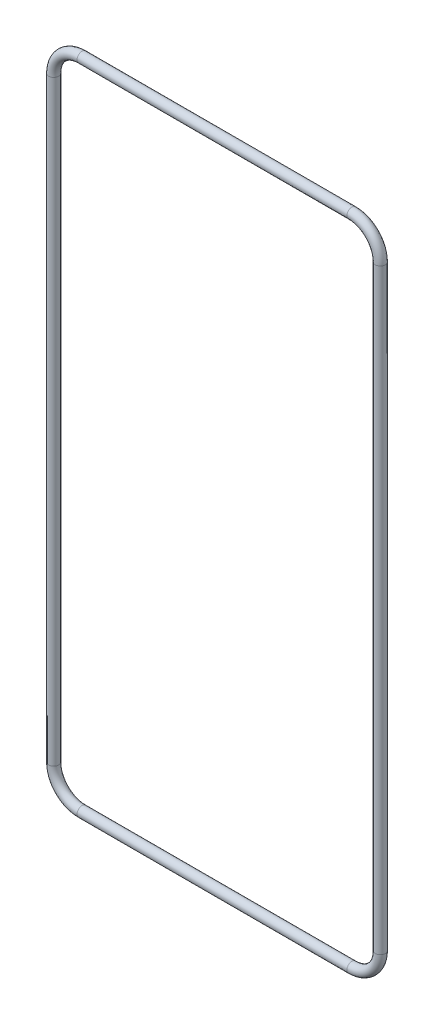
ISO-10303-21;
HEADER;
FILE_DESCRIPTION(('STEP AP214'),'2;1');
FILE_NAME('part.step','',(''),(''),'','','');
FILE_SCHEMA(('AUTOMOTIVE_DESIGN { 1 0 10303 214 1 1 1 1 }'));
ENDSEC;
DATA;
#1=APPLICATION_CONTEXT('core data for automotive mechanical design processes');
#2=APPLICATION_PROTOCOL_DEFINITION('international standard','automotive_design',2000,#1);
#3=PRODUCT_CONTEXT('',#1,'mechanical');
#4=PRODUCT('Part','Part','',(#3));
#5=PRODUCT_RELATED_PRODUCT_CATEGORY('part','',(#4));
#6=PRODUCT_DEFINITION_FORMATION('','',#4);
#7=PRODUCT_DEFINITION_CONTEXT('part definition',#1,'design');
#8=PRODUCT_DEFINITION('design','',#6,#7);
#9=PRODUCT_DEFINITION_SHAPE('','',#8);
#10=(LENGTH_UNIT() NAMED_UNIT(*) SI_UNIT(.MILLI.,.METRE.));
#11=(NAMED_UNIT(*) PLANE_ANGLE_UNIT() SI_UNIT($,.RADIAN.));
#12=(NAMED_UNIT(*) SI_UNIT($,.STERADIAN.) SOLID_ANGLE_UNIT());
#13=UNCERTAINTY_MEASURE_WITH_UNIT(LENGTH_MEASURE(1.E-05),#10,'distance_accuracy_value','');
#14=(GEOMETRIC_REPRESENTATION_CONTEXT(3) GLOBAL_UNCERTAINTY_ASSIGNED_CONTEXT((#13)) GLOBAL_UNIT_ASSIGNED_CONTEXT((#10,
#11,#12)) REPRESENTATION_CONTEXT('',''));
#15=CARTESIAN_POINT('',(0.,0.,0.));
#16=DIRECTION('',(0.,0.,1.));
#17=DIRECTION('',(1.,0.,0.));
#18=AXIS2_PLACEMENT_3D('',#15,#16,#17);
#19=CARTESIAN_POINT('',(39.0023029850917,96.2815448697428,0.));
#20=DIRECTION('',(0.,0.,-1.));
#21=DIRECTION('',(-1.,0.,0.));
#22=AXIS2_PLACEMENT_3D('',#19,#20,#21);
#23=TOROIDAL_SURFACE('',#22,9.99999999999997,1.76500000000001);
#24=CARTESIAN_POINT('',(39.0023029850917,106.281544869743,0.));
#25=DIRECTION('',(-1.,0.,0.));
#26=DIRECTION('',(0.,0.,1.));
#27=AXIS2_PLACEMENT_3D('',#24,#25,#26);
#28=CIRCLE('',#27,1.76500000000001);
#29=CARTESIAN_POINT('',(39.0023029850917,108.046544869743,0.));
#30=VERTEX_POINT('',#29);
#31=EDGE_CURVE('E35',#30,#30,#28,.T.);
#32=CARTESIAN_POINT('',(49.0023029850916,96.2815448697428,0.));
#33=DIRECTION('',(0.,1.,0.));
#34=DIRECTION('',(0.,0.,1.));
#35=AXIS2_PLACEMENT_3D('',#32,#33,#34);
#36=CIRCLE('',#35,1.76500000000001);
#37=CARTESIAN_POINT('',(50.7673029850917,96.2815448697428,0.));
#38=VERTEX_POINT('',#37);
#39=EDGE_CURVE('E10',#38,#38,#36,.T.);
#40=CARTESIAN_POINT('',(39.0023029850917,96.2815448697428,0.));
#41=DIRECTION('',(0.,0.,-1.));
#42=DIRECTION('',(-1.,0.,0.));
#43=AXIS2_PLACEMENT_3D('',#40,#41,#42);
#44=CIRCLE('',#43,11.765);
#45=EDGE_CURVE('',#30,#38,#44,.T.);
#46=ORIENTED_EDGE('',*,*,#31,.F.);
#47=ORIENTED_EDGE('',*,*,#39,.T.);
#48=ORIENTED_EDGE('',*,*,#45,.T.);
#49=ORIENTED_EDGE('',*,*,#45,.F.);
#50=EDGE_LOOP('',(#46,#48,#47,#49));
#51=FACE_BOUND('',#50,.T.);
#52=ADVANCED_FACE('F29',(#51),#23,.T.);
#53=CARTESIAN_POINT('',(-55.9976970149083,106.281544869743,0.));
#54=DIRECTION('',(1.,0.,0.));
#55=DIRECTION('',(0.,1.,0.));
#56=AXIS2_PLACEMENT_3D('',#53,#54,#55);
#57=CYLINDRICAL_SURFACE('',#56,1.76500000000001);
#58=CARTESIAN_POINT('',(-55.9976970149083,106.281544869743,0.));
#59=DIRECTION('',(-1.,0.,0.));
#60=DIRECTION('',(0.,0.,1.));
#61=AXIS2_PLACEMENT_3D('',#58,#59,#60);
#62=CIRCLE('',#61,1.76500000000001);
#63=CARTESIAN_POINT('',(-55.9976970149083,108.046544869743,0.));
#64=VERTEX_POINT('',#63);
#65=EDGE_CURVE('E39',#64,#64,#62,.T.);
#66=ORIENTED_EDGE('',*,*,#65,.F.);
#67=EDGE_LOOP('',(#66));
#68=FACE_BOUND('',#67,.T.);
#69=ORIENTED_EDGE('',*,*,#31,.T.);
#70=EDGE_LOOP('',(#69));
#71=FACE_BOUND('',#70,.T.);
#72=ADVANCED_FACE('F91',(#68,#71),#57,.T.);
#73=CARTESIAN_POINT('',(-55.9976970149083,96.2815448697428,0.));
#74=DIRECTION('',(0.,0.,-1.));
#75=DIRECTION('',(-1.,0.,0.));
#76=AXIS2_PLACEMENT_3D('',#73,#74,#75);
#77=TOROIDAL_SURFACE('',#76,9.99999999999999,1.76500000000001);
#78=CARTESIAN_POINT('',(-65.9976970149083,96.2815448697428,0.));
#79=DIRECTION('',(0.,-1.,0.));
#80=DIRECTION('',(0.,0.,1.));
#81=AXIS2_PLACEMENT_3D('',#78,#79,#80);
#82=CIRCLE('',#81,1.76500000000001);
#83=CARTESIAN_POINT('',(-67.7626970149083,96.2815448697428,0.));
#84=VERTEX_POINT('',#83);
#85=EDGE_CURVE('E43',#84,#84,#82,.T.);
#86=CARTESIAN_POINT('',(-55.9976970149083,96.2815448697428,0.));
#87=DIRECTION('',(0.,0.,-1.));
#88=DIRECTION('',(-1.,0.,0.));
#89=AXIS2_PLACEMENT_3D('',#86,#87,#88);
#90=CIRCLE('',#89,11.765);
#91=EDGE_CURVE('',#84,#64,#90,.T.);
#92=ORIENTED_EDGE('',*,*,#85,.F.);
#93=ORIENTED_EDGE('',*,*,#65,.T.);
#94=ORIENTED_EDGE('',*,*,#91,.T.);
#95=ORIENTED_EDGE('',*,*,#91,.F.);
#96=EDGE_LOOP('',(#92,#94,#93,#95));
#97=FACE_BOUND('',#96,.T.);
#98=ADVANCED_FACE('F85',(#97),#77,.T.);
#99=CARTESIAN_POINT('',(-65.9976970149083,-113.718455130257,0.));
#100=DIRECTION('',(0.,1.,0.));
#101=DIRECTION('',(0.,0.,1.));
#102=AXIS2_PLACEMENT_3D('',#99,#100,#101);
#103=CYLINDRICAL_SURFACE('',#102,1.76500000000001);
#104=CARTESIAN_POINT('',(-65.9976970149083,-113.718455130257,0.));
#105=DIRECTION('',(0.,-1.,0.));
#106=DIRECTION('',(0.,0.,1.));
#107=AXIS2_PLACEMENT_3D('',#104,#105,#106);
#108=CIRCLE('',#107,1.76500000000001);
#109=CARTESIAN_POINT('',(-67.7626970149083,-113.718455130257,0.));
#110=VERTEX_POINT('',#109);
#111=EDGE_CURVE('E48',#110,#110,#108,.T.);
#112=ORIENTED_EDGE('',*,*,#111,.F.);
#113=EDGE_LOOP('',(#112));
#114=FACE_BOUND('',#113,.T.);
#115=ORIENTED_EDGE('',*,*,#85,.T.);
#116=EDGE_LOOP('',(#115));
#117=FACE_BOUND('',#116,.T.);
#118=ADVANCED_FACE('F79',(#114,#117),#103,.T.);
#119=CARTESIAN_POINT('',(-55.9976970149083,-113.718455130257,0.));
#120=DIRECTION('',(0.,0.,-1.));
#121=DIRECTION('',(-1.,0.,0.));
#122=AXIS2_PLACEMENT_3D('',#119,#120,#121);
#123=TOROIDAL_SURFACE('',#122,9.99999999999998,1.76500000000001);
#124=CARTESIAN_POINT('',(-55.9976970149083,-123.718455130257,0.));
#125=DIRECTION('',(1.,0.,0.));
#126=DIRECTION('',(0.,0.,1.));
#127=AXIS2_PLACEMENT_3D('',#124,#125,#126);
#128=CIRCLE('',#127,1.76500000000001);
#129=CARTESIAN_POINT('',(-55.9976970149082,-125.483455130257,0.));
#130=VERTEX_POINT('',#129);
#131=EDGE_CURVE('E51',#130,#130,#128,.T.);
#132=CARTESIAN_POINT('',(-55.9976970149083,-113.718455130257,0.));
#133=DIRECTION('',(0.,0.,-1.));
#134=DIRECTION('',(-1.,0.,0.));
#135=AXIS2_PLACEMENT_3D('',#132,#133,#134);
#136=CIRCLE('',#135,11.765);
#137=EDGE_CURVE('',#130,#110,#136,.T.);
#138=ORIENTED_EDGE('',*,*,#131,.F.);
#139=ORIENTED_EDGE('',*,*,#111,.T.);
#140=ORIENTED_EDGE('',*,*,#137,.T.);
#141=ORIENTED_EDGE('',*,*,#137,.F.);
#142=EDGE_LOOP('',(#138,#140,#139,#141));
#143=FACE_BOUND('',#142,.T.);
#144=ADVANCED_FACE('F73',(#143),#123,.T.);
#145=CARTESIAN_POINT('',(39.0023029850917,-123.718455130257,0.));
#146=DIRECTION('',(-1.,0.,0.));
#147=DIRECTION('',(0.,0.,1.));
#148=AXIS2_PLACEMENT_3D('',#145,#146,#147);
#149=CYLINDRICAL_SURFACE('',#148,1.76500000000001);
#150=CARTESIAN_POINT('',(39.0023029850917,-123.718455130257,0.));
#151=DIRECTION('',(1.,0.,0.));
#152=DIRECTION('',(0.,0.,1.));
#153=AXIS2_PLACEMENT_3D('',#150,#151,#152);
#154=CIRCLE('',#153,1.76500000000001);
#155=CARTESIAN_POINT('',(39.0023029850917,-125.483455130257,0.));
#156=VERTEX_POINT('',#155);
#157=EDGE_CURVE('E54',#156,#156,#154,.T.);
#158=ORIENTED_EDGE('',*,*,#157,.F.);
#159=EDGE_LOOP('',(#158));
#160=FACE_BOUND('',#159,.T.);
#161=ORIENTED_EDGE('',*,*,#131,.T.);
#162=EDGE_LOOP('',(#161));
#163=FACE_BOUND('',#162,.T.);
#164=ADVANCED_FACE('F67',(#160,#163),#149,.T.);
#165=CARTESIAN_POINT('',(39.0023029850917,-113.718455130257,0.));
#166=DIRECTION('',(0.,0.,-1.));
#167=DIRECTION('',(-1.,0.,0.));
#168=AXIS2_PLACEMENT_3D('',#165,#166,#167);
#169=TOROIDAL_SURFACE('',#168,9.99999999999999,1.76500000000001);
#170=CARTESIAN_POINT('',(49.0023029850917,-113.718455130257,0.));
#171=DIRECTION('',(0.,1.,0.));
#172=DIRECTION('',(0.,0.,1.));
#173=AXIS2_PLACEMENT_3D('',#170,#171,#172);
#174=CIRCLE('',#173,1.76500000000001);
#175=CARTESIAN_POINT('',(50.7673029850917,-113.718455130257,0.));
#176=VERTEX_POINT('',#175);
#177=EDGE_CURVE('E57',#176,#176,#174,.T.);
#178=CARTESIAN_POINT('',(39.0023029850917,-113.718455130257,0.));
#179=DIRECTION('',(0.,0.,-1.));
#180=DIRECTION('',(-1.,0.,0.));
#181=AXIS2_PLACEMENT_3D('',#178,#179,#180);
#182=CIRCLE('',#181,11.765);
#183=EDGE_CURVE('',#176,#156,#182,.T.);
#184=ORIENTED_EDGE('',*,*,#177,.F.);
#185=ORIENTED_EDGE('',*,*,#157,.T.);
#186=ORIENTED_EDGE('',*,*,#183,.T.);
#187=ORIENTED_EDGE('',*,*,#183,.F.);
#188=EDGE_LOOP('',(#184,#186,#185,#187));
#189=FACE_BOUND('',#188,.T.);
#190=ADVANCED_FACE('F64',(#189),#169,.T.);
#191=CARTESIAN_POINT('',(49.0023029850917,-113.718455130257,0.));
#192=DIRECTION('',(0.,1.,0.));
#193=DIRECTION('',(-1.,0.,0.));
#194=AXIS2_PLACEMENT_3D('',#191,#192,#193);
#195=CYLINDRICAL_SURFACE('',#194,1.76500000000001);
#196=ORIENTED_EDGE('',*,*,#177,.T.);
#197=EDGE_LOOP('',(#196));
#198=FACE_BOUND('',#197,.T.);
#199=ORIENTED_EDGE('',*,*,#39,.F.);
#200=EDGE_LOOP('',(#199));
#201=FACE_BOUND('',#200,.T.);
#202=ADVANCED_FACE('F61',(#198,#201),#195,.T.);
#203=CLOSED_SHELL('',(#52,#72,#98,#118,#144,#164,#190,#202));
#204=MANIFOLD_SOLID_BREP('B2',#203);
#205=ADVANCED_BREP_SHAPE_REPRESENTATION('',(#18,#204),#14);
#206=SHAPE_DEFINITION_REPRESENTATION(#9,#205);
ENDSEC;
END-ISO-10303-21;
